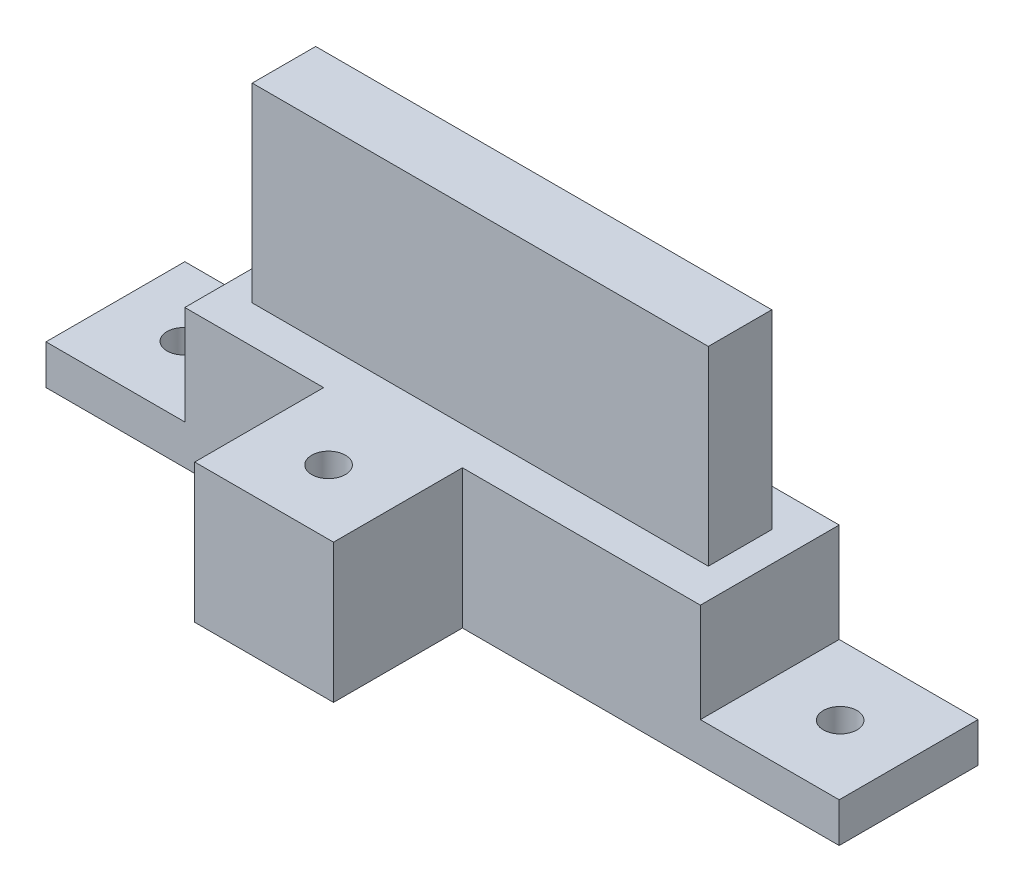
ISO-10303-21;
HEADER;
FILE_DESCRIPTION(('STEP AP214'),'2;1');
FILE_NAME('part.step','',(''),(''),'','','');
FILE_SCHEMA(('AUTOMOTIVE_DESIGN { 1 0 10303 214 1 1 1 1 }'));
ENDSEC;
DATA;
#1=APPLICATION_CONTEXT('core data for automotive mechanical design processes');
#2=APPLICATION_PROTOCOL_DEFINITION('international standard','automotive_design',2000,#1);
#3=PRODUCT_CONTEXT('',#1,'mechanical');
#4=PRODUCT('Part','Part','',(#3));
#5=PRODUCT_RELATED_PRODUCT_CATEGORY('part','',(#4));
#6=PRODUCT_DEFINITION_FORMATION('','',#4);
#7=PRODUCT_DEFINITION_CONTEXT('part definition',#1,'design');
#8=PRODUCT_DEFINITION('design','',#6,#7);
#9=PRODUCT_DEFINITION_SHAPE('','',#8);
#10=(LENGTH_UNIT() NAMED_UNIT(*) SI_UNIT(.MILLI.,.METRE.));
#11=(NAMED_UNIT(*) PLANE_ANGLE_UNIT() SI_UNIT($,.RADIAN.));
#12=(NAMED_UNIT(*) SI_UNIT($,.STERADIAN.) SOLID_ANGLE_UNIT());
#13=UNCERTAINTY_MEASURE_WITH_UNIT(LENGTH_MEASURE(1.E-05),#10,'distance_accuracy_value','');
#14=(GEOMETRIC_REPRESENTATION_CONTEXT(3) GLOBAL_UNCERTAINTY_ASSIGNED_CONTEXT((#13)) GLOBAL_UNIT_ASSIGNED_CONTEXT((#10,
#11,#12)) REPRESENTATION_CONTEXT('',''));
#15=CARTESIAN_POINT('',(0.,0.,0.));
#16=DIRECTION('',(0.,0.,1.));
#17=DIRECTION('',(1.,0.,0.));
#18=AXIS2_PLACEMENT_3D('',#15,#16,#17);
#19=CARTESIAN_POINT('',(0.,0.,17.5));
#20=DIRECTION('',(0.,0.,1.));
#21=DIRECTION('',(1.,0.,0.));
#22=AXIS2_PLACEMENT_3D('',#19,#20,#21);
#23=PLANE('',#22);
#24=DIRECTION('',(1.,0.,0.));
#25=VECTOR('',#24,1.);
#26=CARTESIAN_POINT('',(-100.,0.,17.5));
#27=LINE('',#26,#25);
#28=CARTESIAN_POINT('',(-100.,0.,17.5));
#29=VERTEX_POINT('',#28);
#30=CARTESIAN_POINT('',(-30.,0.,17.5));
#31=VERTEX_POINT('',#30);
#32=EDGE_CURVE('E57',#29,#31,#27,.T.);
#33=ORIENTED_EDGE('',*,*,#32,.T.);
#34=DIRECTION('',(0.,1.,0.));
#35=VECTOR('',#34,1.);
#36=CARTESIAN_POINT('',(-30.,0.,17.5));
#37=LINE('',#36,#35);
#38=CARTESIAN_POINT('',(-30.,35.,17.5));
#39=VERTEX_POINT('',#38);
#40=EDGE_CURVE('E195',#31,#39,#37,.T.);
#41=ORIENTED_EDGE('',*,*,#40,.T.);
#42=DIRECTION('',(-1.,0.,0.));
#43=VECTOR('',#42,1.);
#44=CARTESIAN_POINT('',(65.,35.,17.5));
#45=LINE('',#44,#43);
#46=CARTESIAN_POINT('',(-65.,35.,17.5));
#47=VERTEX_POINT('',#46);
#48=EDGE_CURVE('E232',#39,#47,#45,.T.);
#49=ORIENTED_EDGE('',*,*,#48,.T.);
#50=DIRECTION('',(0.,-1.,0.));
#51=VECTOR('',#50,1.);
#52=CARTESIAN_POINT('',(-65.,9.99999999999998,17.5));
#53=LINE('',#52,#51);
#54=CARTESIAN_POINT('',(-65.,9.99999999999998,17.5));
#55=VERTEX_POINT('',#54);
#56=EDGE_CURVE('E235',#47,#55,#53,.T.);
#57=ORIENTED_EDGE('',*,*,#56,.T.);
#58=DIRECTION('',(-1.,0.,0.));
#59=VECTOR('',#58,1.);
#60=CARTESIAN_POINT('',(-100.,9.99999999999998,17.5));
#61=LINE('',#60,#59);
#62=CARTESIAN_POINT('',(-100.,9.99999999999998,17.5));
#63=VERTEX_POINT('',#62);
#64=EDGE_CURVE('E237',#55,#63,#61,.T.);
#65=ORIENTED_EDGE('',*,*,#64,.T.);
#66=DIRECTION('',(0.,-1.,0.));
#67=VECTOR('',#66,1.);
#68=CARTESIAN_POINT('',(-100.,0.,17.5));
#69=LINE('',#68,#67);
#70=EDGE_CURVE('E239',#63,#29,#69,.T.);
#71=ORIENTED_EDGE('',*,*,#70,.T.);
#72=EDGE_LOOP('',(#33,#41,#49,#57,#65,#71));
#73=FACE_BOUND('',#72,.T.);
#74=ADVANCED_FACE('F34',(#73),#23,.T.);
#75=CARTESIAN_POINT('',(65.,35.,17.5));
#76=VERTEX_POINT('',#75);
#77=CARTESIAN_POINT('',(4.99999999999999,35.,17.5));
#78=VERTEX_POINT('',#77);
#79=EDGE_CURVE('E233',#76,#78,#45,.T.);
#80=ORIENTED_EDGE('',*,*,#79,.T.);
#81=DIRECTION('',(0.,-1.,0.));
#82=VECTOR('',#81,1.);
#83=CARTESIAN_POINT('',(4.99999999999999,0.,17.5));
#84=LINE('',#83,#82);
#85=CARTESIAN_POINT('',(4.99999999999999,0.,17.5));
#86=VERTEX_POINT('',#85);
#87=EDGE_CURVE('E49',#78,#86,#84,.T.);
#88=ORIENTED_EDGE('',*,*,#87,.T.);
#89=CARTESIAN_POINT('',(100.,0.,17.5));
#90=VERTEX_POINT('',#89);
#91=EDGE_CURVE('E241',#86,#90,#27,.T.);
#92=ORIENTED_EDGE('',*,*,#91,.T.);
#93=DIRECTION('',(0.,1.,0.));
#94=VECTOR('',#93,1.);
#95=CARTESIAN_POINT('',(100.,0.,17.5));
#96=LINE('',#95,#94);
#97=CARTESIAN_POINT('',(100.,10.,17.5));
#98=VERTEX_POINT('',#97);
#99=EDGE_CURVE('E224',#90,#98,#96,.T.);
#100=ORIENTED_EDGE('',*,*,#99,.T.);
#101=DIRECTION('',(-1.,0.,0.));
#102=VECTOR('',#101,1.);
#103=CARTESIAN_POINT('',(100.,10.,17.5));
#104=LINE('',#103,#102);
#105=CARTESIAN_POINT('',(65.,10.,17.5));
#106=VERTEX_POINT('',#105);
#107=EDGE_CURVE('E227',#98,#106,#104,.T.);
#108=ORIENTED_EDGE('',*,*,#107,.T.);
#109=DIRECTION('',(0.,1.,0.));
#110=VECTOR('',#109,1.);
#111=CARTESIAN_POINT('',(65.,10.,17.5));
#112=LINE('',#111,#110);
#113=EDGE_CURVE('E230',#106,#76,#112,.T.);
#114=ORIENTED_EDGE('',*,*,#113,.T.);
#115=EDGE_LOOP('',(#80,#88,#92,#100,#108,#114));
#116=FACE_BOUND('',#115,.T.);
#117=ADVANCED_FACE('F367',(#116),#23,.T.);
#118=CARTESIAN_POINT('',(0.,0.,-17.5));
#119=DIRECTION('',(0.,0.,1.));
#120=DIRECTION('',(1.,0.,0.));
#121=AXIS2_PLACEMENT_3D('',#118,#119,#120);
#122=PLANE('',#121);
#123=DIRECTION('',(0.,1.,0.));
#124=VECTOR('',#123,1.);
#125=CARTESIAN_POINT('',(-30.,0.,-17.5));
#126=LINE('',#125,#124);
#127=CARTESIAN_POINT('',(-30.,0.,-17.5));
#128=VERTEX_POINT('',#127);
#129=CARTESIAN_POINT('',(-30.,35.,-17.5));
#130=VERTEX_POINT('',#129);
#131=EDGE_CURVE('E12',#128,#130,#126,.T.);
#132=ORIENTED_EDGE('',*,*,#131,.F.);
#133=DIRECTION('',(1.,0.,0.));
#134=VECTOR('',#133,1.);
#135=CARTESIAN_POINT('',(-100.,0.,-17.5));
#136=LINE('',#135,#134);
#137=CARTESIAN_POINT('',(-100.,0.,-17.5));
#138=VERTEX_POINT('',#137);
#139=EDGE_CURVE('E228',#138,#128,#136,.T.);
#140=ORIENTED_EDGE('',*,*,#139,.F.);
#141=DIRECTION('',(0.,-1.,0.));
#142=VECTOR('',#141,1.);
#143=CARTESIAN_POINT('',(-100.,0.,-17.5));
#144=LINE('',#143,#142);
#145=CARTESIAN_POINT('',(-100.,9.99999999999998,-17.5));
#146=VERTEX_POINT('',#145);
#147=EDGE_CURVE('E259',#146,#138,#144,.T.);
#148=ORIENTED_EDGE('',*,*,#147,.F.);
#149=DIRECTION('',(-1.,0.,0.));
#150=VECTOR('',#149,1.);
#151=CARTESIAN_POINT('',(-100.,9.99999999999998,-17.5));
#152=LINE('',#151,#150);
#153=CARTESIAN_POINT('',(-65.,9.99999999999998,-17.5));
#154=VERTEX_POINT('',#153);
#155=EDGE_CURVE('E257',#154,#146,#152,.T.);
#156=ORIENTED_EDGE('',*,*,#155,.F.);
#157=DIRECTION('',(0.,-1.,0.));
#158=VECTOR('',#157,1.);
#159=CARTESIAN_POINT('',(-65.,9.99999999999998,-17.5));
#160=LINE('',#159,#158);
#161=CARTESIAN_POINT('',(-65.,35.,-17.5));
#162=VERTEX_POINT('',#161);
#163=EDGE_CURVE('E255',#162,#154,#160,.T.);
#164=ORIENTED_EDGE('',*,*,#163,.F.);
#165=DIRECTION('',(-1.,0.,0.));
#166=VECTOR('',#165,1.);
#167=CARTESIAN_POINT('',(-65.,35.,-17.5));
#168=LINE('',#167,#166);
#169=EDGE_CURVE('E251',#130,#162,#168,.T.);
#170=ORIENTED_EDGE('',*,*,#169,.F.);
#171=EDGE_LOOP('',(#132,#140,#148,#156,#164,#170));
#172=FACE_BOUND('',#171,.T.);
#173=ADVANCED_FACE('F355',(#172),#122,.F.);
#174=DIRECTION('',(0.,-1.,0.));
#175=VECTOR('',#174,1.);
#176=CARTESIAN_POINT('',(4.99999999999999,0.,-17.5));
#177=LINE('',#176,#175);
#178=CARTESIAN_POINT('',(4.99999999999999,35.,-17.5));
#179=VERTEX_POINT('',#178);
#180=CARTESIAN_POINT('',(4.99999999999999,0.,-17.5));
#181=VERTEX_POINT('',#180);
#182=EDGE_CURVE('E42',#179,#181,#177,.T.);
#183=ORIENTED_EDGE('',*,*,#182,.F.);
#184=CARTESIAN_POINT('',(65.,35.,-17.5));
#185=VERTEX_POINT('',#184);
#186=EDGE_CURVE('E252',#185,#179,#168,.T.);
#187=ORIENTED_EDGE('',*,*,#186,.F.);
#188=DIRECTION('',(0.,1.,0.));
#189=VECTOR('',#188,1.);
#190=CARTESIAN_POINT('',(65.,10.,-17.5));
#191=LINE('',#190,#189);
#192=CARTESIAN_POINT('',(65.,10.,-17.5));
#193=VERTEX_POINT('',#192);
#194=EDGE_CURVE('E248',#193,#185,#191,.T.);
#195=ORIENTED_EDGE('',*,*,#194,.F.);
#196=DIRECTION('',(-1.,0.,0.));
#197=VECTOR('',#196,1.);
#198=CARTESIAN_POINT('',(100.,10.,-17.5));
#199=LINE('',#198,#197);
#200=CARTESIAN_POINT('',(100.,10.,-17.5));
#201=VERTEX_POINT('',#200);
#202=EDGE_CURVE('E246',#201,#193,#199,.T.);
#203=ORIENTED_EDGE('',*,*,#202,.F.);
#204=DIRECTION('',(0.,1.,0.));
#205=VECTOR('',#204,1.);
#206=CARTESIAN_POINT('',(100.,0.,-17.5));
#207=LINE('',#206,#205);
#208=CARTESIAN_POINT('',(100.,0.,-17.5));
#209=VERTEX_POINT('',#208);
#210=EDGE_CURVE('E217',#209,#201,#207,.T.);
#211=ORIENTED_EDGE('',*,*,#210,.F.);
#212=EDGE_CURVE('E261',#181,#209,#136,.T.);
#213=ORIENTED_EDGE('',*,*,#212,.F.);
#214=EDGE_LOOP('',(#183,#187,#195,#203,#211,#213));
#215=FACE_BOUND('',#214,.T.);
#216=ADVANCED_FACE('F313',(#215),#122,.F.);
#217=CARTESIAN_POINT('',(57.5,35.,17.5));
#218=DIRECTION('',(-1.,0.,0.));
#219=DIRECTION('',(0.,-1.,0.));
#220=AXIS2_PLACEMENT_3D('',#217,#218,#219);
#221=PLANE('',#220);
#222=DIRECTION('',(0.,1.,0.));
#223=VECTOR('',#222,1.);
#224=CARTESIAN_POINT('',(57.5,-170.069799092894,-8.));
#225=LINE('',#224,#223);
#226=CARTESIAN_POINT('',(57.5,35.,-8.));
#227=VERTEX_POINT('',#226);
#228=CARTESIAN_POINT('',(57.5,83.,-8.));
#229=VERTEX_POINT('',#228);
#230=EDGE_CURVE('E208',#227,#229,#225,.T.);
#231=ORIENTED_EDGE('',*,*,#230,.T.);
#232=DIRECTION('',(0.,0.,-1.));
#233=VECTOR('',#232,1.);
#234=CARTESIAN_POINT('',(57.5,83.,17.5));
#235=LINE('',#234,#233);
#236=CARTESIAN_POINT('',(57.5,83.,8.));
#237=VERTEX_POINT('',#236);
#238=EDGE_CURVE('E284',#237,#229,#235,.T.);
#239=ORIENTED_EDGE('',*,*,#238,.F.);
#240=DIRECTION('',(0.,1.,0.));
#241=VECTOR('',#240,1.);
#242=CARTESIAN_POINT('',(57.5,-170.069799092894,8.));
#243=LINE('',#242,#241);
#244=CARTESIAN_POINT('',(57.5,35.,8.));
#245=VERTEX_POINT('',#244);
#246=EDGE_CURVE('E207',#245,#237,#243,.T.);
#247=ORIENTED_EDGE('',*,*,#246,.F.);
#248=DIRECTION('',(0.,0.,-1.));
#249=VECTOR('',#248,1.);
#250=CARTESIAN_POINT('',(57.5,35.,17.5));
#251=LINE('',#250,#249);
#252=EDGE_CURVE('E287',#245,#227,#251,.T.);
#253=ORIENTED_EDGE('',*,*,#252,.T.);
#254=EDGE_LOOP('',(#231,#239,#247,#253));
#255=FACE_BOUND('',#254,.T.);
#256=ADVANCED_FACE('F399',(#255),#221,.F.);
#257=CARTESIAN_POINT('',(57.5,83.,17.5));
#258=DIRECTION('',(0.,-1.,0.));
#259=DIRECTION('',(1.,0.,0.));
#260=AXIS2_PLACEMENT_3D('',#257,#258,#259);
#261=PLANE('',#260);
#262=DIRECTION('',(-1.,0.,0.));
#263=VECTOR('',#262,1.);
#264=CARTESIAN_POINT('',(-57.5,83.,-8.));
#265=LINE('',#264,#263);
#266=CARTESIAN_POINT('',(-57.5,83.,-8.));
#267=VERTEX_POINT('',#266);
#268=EDGE_CURVE('E204',#229,#267,#265,.T.);
#269=ORIENTED_EDGE('',*,*,#268,.T.);
#270=DIRECTION('',(0.,0.,-1.));
#271=VECTOR('',#270,1.);
#272=CARTESIAN_POINT('',(-57.5,83.,17.5));
#273=LINE('',#272,#271);
#274=CARTESIAN_POINT('',(-57.5,83.,8.));
#275=VERTEX_POINT('',#274);
#276=EDGE_CURVE('E281',#275,#267,#273,.T.);
#277=ORIENTED_EDGE('',*,*,#276,.F.);
#278=DIRECTION('',(1.,0.,0.));
#279=VECTOR('',#278,1.);
#280=CARTESIAN_POINT('',(-57.5,83.,8.));
#281=LINE('',#280,#279);
#282=EDGE_CURVE('E209',#275,#237,#281,.T.);
#283=ORIENTED_EDGE('',*,*,#282,.T.);
#284=ORIENTED_EDGE('',*,*,#238,.T.);
#285=EDGE_LOOP('',(#269,#277,#283,#284));
#286=FACE_BOUND('',#285,.T.);
#287=ADVANCED_FACE('F395',(#286),#261,.F.);
#288=CARTESIAN_POINT('',(-57.5,35.,17.5));
#289=DIRECTION('',(1.,0.,0.));
#290=DIRECTION('',(0.,1.,0.));
#291=AXIS2_PLACEMENT_3D('',#288,#289,#290);
#292=PLANE('',#291);
#293=DIRECTION('',(0.,1.,0.));
#294=VECTOR('',#293,1.);
#295=CARTESIAN_POINT('',(-57.5,-170.069799092894,-8.));
#296=LINE('',#295,#294);
#297=CARTESIAN_POINT('',(-57.5,35.,-8.));
#298=VERTEX_POINT('',#297);
#299=EDGE_CURVE('E203',#298,#267,#296,.T.);
#300=ORIENTED_EDGE('',*,*,#299,.F.);
#301=DIRECTION('',(0.,0.,-1.));
#302=VECTOR('',#301,1.);
#303=CARTESIAN_POINT('',(-57.5,35.,17.5));
#304=LINE('',#303,#302);
#305=CARTESIAN_POINT('',(-57.5,35.,8.));
#306=VERTEX_POINT('',#305);
#307=EDGE_CURVE('E278',#306,#298,#304,.T.);
#308=ORIENTED_EDGE('',*,*,#307,.F.);
#309=DIRECTION('',(0.,1.,0.));
#310=VECTOR('',#309,1.);
#311=CARTESIAN_POINT('',(-57.5,-170.069799092894,8.));
#312=LINE('',#311,#310);
#313=EDGE_CURVE('E213',#306,#275,#312,.T.);
#314=ORIENTED_EDGE('',*,*,#313,.T.);
#315=ORIENTED_EDGE('',*,*,#276,.T.);
#316=EDGE_LOOP('',(#300,#308,#314,#315));
#317=FACE_BOUND('',#316,.T.);
#318=ADVANCED_FACE('F392',(#317),#292,.F.);
#319=CARTESIAN_POINT('',(100.,0.,17.5));
#320=DIRECTION('',(-1.,0.,0.));
#321=DIRECTION('',(0.,0.,1.));
#322=AXIS2_PLACEMENT_3D('',#319,#320,#321);
#323=PLANE('',#322);
#324=ORIENTED_EDGE('',*,*,#210,.T.);
#325=DIRECTION('',(0.,0.,-1.));
#326=VECTOR('',#325,1.);
#327=CARTESIAN_POINT('',(100.,10.,17.5));
#328=LINE('',#327,#326);
#329=EDGE_CURVE('E296',#98,#201,#328,.T.);
#330=ORIENTED_EDGE('',*,*,#329,.F.);
#331=ORIENTED_EDGE('',*,*,#99,.F.);
#332=DIRECTION('',(0.,0.,-1.));
#333=VECTOR('',#332,1.);
#334=CARTESIAN_POINT('',(100.,0.,17.5));
#335=LINE('',#334,#333);
#336=EDGE_CURVE('E243',#90,#209,#335,.T.);
#337=ORIENTED_EDGE('',*,*,#336,.T.);
#338=EDGE_LOOP('',(#324,#330,#331,#337));
#339=FACE_BOUND('',#338,.T.);
#340=ADVANCED_FACE('F36',(#339),#323,.F.);
#341=CARTESIAN_POINT('',(100.,10.,17.5));
#342=DIRECTION('',(0.,-1.,0.));
#343=DIRECTION('',(1.,0.,0.));
#344=AXIS2_PLACEMENT_3D('',#341,#342,#343);
#345=PLANE('',#344);
#346=CARTESIAN_POINT('',(82.75,10.,0.));
#347=DIRECTION('',(0.,-1.,0.));
#348=DIRECTION('',(1.,0.,0.));
#349=AXIS2_PLACEMENT_3D('',#346,#347,#348);
#350=CIRCLE('',#349,4.25000000000001);
#351=CARTESIAN_POINT('',(87.,10.,0.));
#352=VERTEX_POINT('',#351);
#353=EDGE_CURVE('E415',#352,#352,#350,.T.);
#354=ORIENTED_EDGE('',*,*,#353,.T.);
#355=EDGE_LOOP('',(#354));
#356=FACE_BOUND('',#355,.T.);
#357=ORIENTED_EDGE('',*,*,#202,.T.);
#358=DIRECTION('',(0.,0.,-1.));
#359=VECTOR('',#358,1.);
#360=CARTESIAN_POINT('',(65.,10.,17.5));
#361=LINE('',#360,#359);
#362=EDGE_CURVE('E293',#106,#193,#361,.T.);
#363=ORIENTED_EDGE('',*,*,#362,.F.);
#364=ORIENTED_EDGE('',*,*,#107,.F.);
#365=ORIENTED_EDGE('',*,*,#329,.T.);
#366=EDGE_LOOP('',(#357,#363,#364,#365));
#367=FACE_BOUND('',#366,.T.);
#368=ADVANCED_FACE('F405',(#356,#367),#345,.F.);
#369=CARTESIAN_POINT('',(65.,10.,17.5));
#370=DIRECTION('',(-1.,0.,0.));
#371=DIRECTION('',(0.,-1.,0.));
#372=AXIS2_PLACEMENT_3D('',#369,#370,#371);
#373=PLANE('',#372);
#374=ORIENTED_EDGE('',*,*,#194,.T.);
#375=DIRECTION('',(0.,0.,-1.));
#376=VECTOR('',#375,1.);
#377=CARTESIAN_POINT('',(65.,35.,17.5));
#378=LINE('',#377,#376);
#379=EDGE_CURVE('E290',#76,#185,#378,.T.);
#380=ORIENTED_EDGE('',*,*,#379,.F.);
#381=ORIENTED_EDGE('',*,*,#113,.F.);
#382=ORIENTED_EDGE('',*,*,#362,.T.);
#383=EDGE_LOOP('',(#374,#380,#381,#382));
#384=FACE_BOUND('',#383,.T.);
#385=ADVANCED_FACE('F390',(#384),#373,.F.);
#386=CARTESIAN_POINT('',(-65.,35.,17.5));
#387=DIRECTION('',(0.,-1.,0.));
#388=DIRECTION('',(0.,0.,-1.));
#389=AXIS2_PLACEMENT_3D('',#386,#387,#388);
#390=PLANE('',#389);
#391=CARTESIAN_POINT('',(-12.5,35.,33.75));
#392=DIRECTION('',(0.,1.,0.));
#393=DIRECTION('',(0.,0.,1.));
#394=AXIS2_PLACEMENT_3D('',#391,#392,#393);
#395=CIRCLE('',#394,4.25);
#396=CARTESIAN_POINT('',(-12.5,35.,38.));
#397=VERTEX_POINT('',#396);
#398=EDGE_CURVE('E425',#397,#397,#395,.T.);
#399=ORIENTED_EDGE('',*,*,#398,.F.);
#400=EDGE_LOOP('',(#399));
#401=FACE_BOUND('',#400,.T.);
#402=CARTESIAN_POINT('',(-12.5,35.,-33.75));
#403=DIRECTION('',(0.,1.,0.));
#404=DIRECTION('',(0.,0.,-1.));
#405=AXIS2_PLACEMENT_3D('',#402,#403,#404);
#406=CIRCLE('',#405,4.25);
#407=CARTESIAN_POINT('',(-12.5,35.,-38.));
#408=VERTEX_POINT('',#407);
#409=EDGE_CURVE('E428',#408,#408,#406,.T.);
#410=ORIENTED_EDGE('',*,*,#409,.F.);
#411=EDGE_LOOP('',(#410));
#412=FACE_BOUND('',#411,.T.);
#413=ORIENTED_EDGE('',*,*,#307,.T.);
#414=DIRECTION('',(-1.,0.,0.));
#415=VECTOR('',#414,1.);
#416=CARTESIAN_POINT('',(-57.5,35.,-8.));
#417=LINE('',#416,#415);
#418=EDGE_CURVE('E212',#227,#298,#417,.T.);
#419=ORIENTED_EDGE('',*,*,#418,.F.);
#420=ORIENTED_EDGE('',*,*,#252,.F.);
#421=DIRECTION('',(1.,0.,0.));
#422=VECTOR('',#421,1.);
#423=CARTESIAN_POINT('',(-57.5,35.,8.));
#424=LINE('',#423,#422);
#425=EDGE_CURVE('E215',#306,#245,#424,.T.);
#426=ORIENTED_EDGE('',*,*,#425,.F.);
#427=EDGE_LOOP('',(#413,#419,#420,#426));
#428=FACE_BOUND('',#427,.T.);
#429=DIRECTION('',(0.,0.,-1.));
#430=VECTOR('',#429,1.);
#431=CARTESIAN_POINT('',(-30.,35.,50.));
#432=LINE('',#431,#430);
#433=CARTESIAN_POINT('',(-30.,35.,-50.));
#434=VERTEX_POINT('',#433);
#435=EDGE_CURVE('E323',#130,#434,#432,.T.);
#436=ORIENTED_EDGE('',*,*,#435,.F.);
#437=ORIENTED_EDGE('',*,*,#169,.T.);
#438=DIRECTION('',(0.,0.,-1.));
#439=VECTOR('',#438,1.);
#440=CARTESIAN_POINT('',(-65.,35.,17.5));
#441=LINE('',#440,#439);
#442=EDGE_CURVE('E275',#47,#162,#441,.T.);
#443=ORIENTED_EDGE('',*,*,#442,.F.);
#444=ORIENTED_EDGE('',*,*,#48,.F.);
#445=CARTESIAN_POINT('',(-30.,35.,50.));
#446=VERTEX_POINT('',#445);
#447=EDGE_CURVE('E335',#446,#39,#432,.T.);
#448=ORIENTED_EDGE('',*,*,#447,.F.);
#449=DIRECTION('',(-1.,0.,0.));
#450=VECTOR('',#449,1.);
#451=CARTESIAN_POINT('',(-30.,35.,50.));
#452=LINE('',#451,#450);
#453=CARTESIAN_POINT('',(4.99999999999999,35.,50.));
#454=VERTEX_POINT('',#453);
#455=EDGE_CURVE('E188',#454,#446,#452,.T.);
#456=ORIENTED_EDGE('',*,*,#455,.F.);
#457=DIRECTION('',(0.,0.,-1.));
#458=VECTOR('',#457,1.);
#459=CARTESIAN_POINT('',(4.99999999999999,35.,50.));
#460=LINE('',#459,#458);
#461=EDGE_CURVE('E311',#454,#78,#460,.T.);
#462=ORIENTED_EDGE('',*,*,#461,.T.);
#463=ORIENTED_EDGE('',*,*,#79,.F.);
#464=ORIENTED_EDGE('',*,*,#379,.T.);
#465=ORIENTED_EDGE('',*,*,#186,.T.);
#466=CARTESIAN_POINT('',(4.99999999999999,35.,-50.));
#467=VERTEX_POINT('',#466);
#468=EDGE_CURVE('E304',#179,#467,#460,.T.);
#469=ORIENTED_EDGE('',*,*,#468,.T.);
#470=DIRECTION('',(-1.,0.,0.));
#471=VECTOR('',#470,1.);
#472=CARTESIAN_POINT('',(-30.,35.,-50.));
#473=LINE('',#472,#471);
#474=EDGE_CURVE('E192',#467,#434,#473,.T.);
#475=ORIENTED_EDGE('',*,*,#474,.T.);
#476=EDGE_LOOP('',(#436,#437,#443,#444,#448,#456,#462,#463,#464,#465,#469,#475));
#477=FACE_BOUND('',#476,.T.);
#478=ADVANCED_FACE('F338',(#401,#412,#428,#477),#390,.F.);
#479=CARTESIAN_POINT('',(-65.,9.99999999999998,17.5));
#480=DIRECTION('',(1.,0.,0.));
#481=DIRECTION('',(0.,1.,0.));
#482=AXIS2_PLACEMENT_3D('',#479,#480,#481);
#483=PLANE('',#482);
#484=ORIENTED_EDGE('',*,*,#163,.T.);
#485=DIRECTION('',(0.,0.,-1.));
#486=VECTOR('',#485,1.);
#487=CARTESIAN_POINT('',(-65.,9.99999999999998,17.5));
#488=LINE('',#487,#486);
#489=EDGE_CURVE('E272',#55,#154,#488,.T.);
#490=ORIENTED_EDGE('',*,*,#489,.F.);
#491=ORIENTED_EDGE('',*,*,#56,.F.);
#492=ORIENTED_EDGE('',*,*,#442,.T.);
#493=EDGE_LOOP('',(#484,#490,#491,#492));
#494=FACE_BOUND('',#493,.T.);
#495=ADVANCED_FACE('F352',(#494),#483,.F.);
#496=CARTESIAN_POINT('',(-100.,9.99999999999998,17.5));
#497=DIRECTION('',(0.,-1.,0.));
#498=DIRECTION('',(1.,0.,0.));
#499=AXIS2_PLACEMENT_3D('',#496,#497,#498);
#500=PLANE('',#499);
#501=CARTESIAN_POINT('',(-82.75,9.99999999999998,0.));
#502=DIRECTION('',(0.,-1.,0.));
#503=DIRECTION('',(1.,0.,0.));
#504=AXIS2_PLACEMENT_3D('',#501,#502,#503);
#505=CIRCLE('',#504,4.25000000000001);
#506=CARTESIAN_POINT('',(-78.5,9.99999999999998,0.));
#507=VERTEX_POINT('',#506);
#508=EDGE_CURVE('E329',#507,#507,#505,.T.);
#509=ORIENTED_EDGE('',*,*,#508,.T.);
#510=EDGE_LOOP('',(#509));
#511=FACE_BOUND('',#510,.T.);
#512=ORIENTED_EDGE('',*,*,#155,.T.);
#513=DIRECTION('',(0.,0.,-1.));
#514=VECTOR('',#513,1.);
#515=CARTESIAN_POINT('',(-100.,9.99999999999998,17.5));
#516=LINE('',#515,#514);
#517=EDGE_CURVE('E269',#63,#146,#516,.T.);
#518=ORIENTED_EDGE('',*,*,#517,.F.);
#519=ORIENTED_EDGE('',*,*,#64,.F.);
#520=ORIENTED_EDGE('',*,*,#489,.T.);
#521=EDGE_LOOP('',(#512,#518,#519,#520));
#522=FACE_BOUND('',#521,.T.);
#523=ADVANCED_FACE('F360',(#511,#522),#500,.F.);
#524=CARTESIAN_POINT('',(-100.,0.,17.5));
#525=DIRECTION('',(1.,0.,0.));
#526=DIRECTION('',(0.,1.,0.));
#527=AXIS2_PLACEMENT_3D('',#524,#525,#526);
#528=PLANE('',#527);
#529=ORIENTED_EDGE('',*,*,#147,.T.);
#530=DIRECTION('',(0.,0.,-1.));
#531=VECTOR('',#530,1.);
#532=CARTESIAN_POINT('',(-100.,0.,17.5));
#533=LINE('',#532,#531);
#534=EDGE_CURVE('E266',#29,#138,#533,.T.);
#535=ORIENTED_EDGE('',*,*,#534,.F.);
#536=ORIENTED_EDGE('',*,*,#70,.F.);
#537=ORIENTED_EDGE('',*,*,#517,.T.);
#538=EDGE_LOOP('',(#529,#535,#536,#537));
#539=FACE_BOUND('',#538,.T.);
#540=ADVANCED_FACE('F364',(#539),#528,.F.);
#541=CARTESIAN_POINT('',(-100.,0.,17.5));
#542=DIRECTION('',(0.,1.,0.));
#543=DIRECTION('',(-1.,0.,0.));
#544=AXIS2_PLACEMENT_3D('',#541,#542,#543);
#545=PLANE('',#544);
#546=CARTESIAN_POINT('',(-12.5,0.,33.75));
#547=DIRECTION('',(0.,1.,0.));
#548=DIRECTION('',(0.,0.,1.));
#549=AXIS2_PLACEMENT_3D('',#546,#547,#548);
#550=CIRCLE('',#549,4.25);
#551=CARTESIAN_POINT('',(-12.5,0.,38.));
#552=VERTEX_POINT('',#551);
#553=EDGE_CURVE('E420',#552,#552,#550,.T.);
#554=ORIENTED_EDGE('',*,*,#553,.T.);
#555=EDGE_LOOP('',(#554));
#556=FACE_BOUND('',#555,.T.);
#557=CARTESIAN_POINT('',(-82.75,0.,0.));
#558=DIRECTION('',(0.,1.,0.));
#559=DIRECTION('',(0.,0.,1.));
#560=AXIS2_PLACEMENT_3D('',#557,#558,#559);
#561=CIRCLE('',#560,4.25000000000001);
#562=CARTESIAN_POINT('',(-82.75,0.,4.25000000000001));
#563=VERTEX_POINT('',#562);
#564=EDGE_CURVE('E437',#563,#563,#561,.T.);
#565=ORIENTED_EDGE('',*,*,#564,.T.);
#566=EDGE_LOOP('',(#565));
#567=FACE_BOUND('',#566,.T.);
#568=CARTESIAN_POINT('',(82.75,0.,0.));
#569=DIRECTION('',(0.,1.,0.));
#570=DIRECTION('',(0.,0.,1.));
#571=AXIS2_PLACEMENT_3D('',#568,#569,#570);
#572=CIRCLE('',#571,4.25000000000001);
#573=CARTESIAN_POINT('',(82.75,0.,4.25000000000001));
#574=VERTEX_POINT('',#573);
#575=EDGE_CURVE('E434',#574,#574,#572,.T.);
#576=ORIENTED_EDGE('',*,*,#575,.T.);
#577=EDGE_LOOP('',(#576));
#578=FACE_BOUND('',#577,.T.);
#579=CARTESIAN_POINT('',(-12.5,0.,-33.75));
#580=DIRECTION('',(0.,1.,0.));
#581=DIRECTION('',(0.,0.,-1.));
#582=AXIS2_PLACEMENT_3D('',#579,#580,#581);
#583=CIRCLE('',#582,4.25);
#584=CARTESIAN_POINT('',(-12.5,0.,-38.));
#585=VERTEX_POINT('',#584);
#586=EDGE_CURVE('E431',#585,#585,#583,.T.);
#587=ORIENTED_EDGE('',*,*,#586,.T.);
#588=EDGE_LOOP('',(#587));
#589=FACE_BOUND('',#588,.T.);
#590=DIRECTION('',(0.,0.,-1.));
#591=VECTOR('',#590,1.);
#592=CARTESIAN_POINT('',(4.99999999999999,0.,50.));
#593=LINE('',#592,#591);
#594=CARTESIAN_POINT('',(4.99999999999999,0.,-50.));
#595=VERTEX_POINT('',#594);
#596=EDGE_CURVE('E302',#181,#595,#593,.T.);
#597=ORIENTED_EDGE('',*,*,#596,.F.);
#598=ORIENTED_EDGE('',*,*,#212,.T.);
#599=ORIENTED_EDGE('',*,*,#336,.F.);
#600=ORIENTED_EDGE('',*,*,#91,.F.);
#601=CARTESIAN_POINT('',(4.99999999999999,0.,50.));
#602=VERTEX_POINT('',#601);
#603=EDGE_CURVE('E179',#602,#86,#593,.T.);
#604=ORIENTED_EDGE('',*,*,#603,.F.);
#605=DIRECTION('',(1.,0.,0.));
#606=VECTOR('',#605,1.);
#607=CARTESIAN_POINT('',(-30.,0.,50.));
#608=LINE('',#607,#606);
#609=CARTESIAN_POINT('',(-30.,0.,50.));
#610=VERTEX_POINT('',#609);
#611=EDGE_CURVE('E172',#610,#602,#608,.T.);
#612=ORIENTED_EDGE('',*,*,#611,.F.);
#613=DIRECTION('',(0.,0.,-1.));
#614=VECTOR('',#613,1.);
#615=CARTESIAN_POINT('',(-30.,0.,50.));
#616=LINE('',#615,#614);
#617=EDGE_CURVE('E177',#610,#31,#616,.T.);
#618=ORIENTED_EDGE('',*,*,#617,.T.);
#619=ORIENTED_EDGE('',*,*,#32,.F.);
#620=ORIENTED_EDGE('',*,*,#534,.T.);
#621=ORIENTED_EDGE('',*,*,#139,.T.);
#622=CARTESIAN_POINT('',(-30.,0.,-50.));
#623=VERTEX_POINT('',#622);
#624=EDGE_CURVE('E196',#128,#623,#616,.T.);
#625=ORIENTED_EDGE('',*,*,#624,.T.);
#626=DIRECTION('',(1.,0.,0.));
#627=VECTOR('',#626,1.);
#628=CARTESIAN_POINT('',(-30.,0.,-50.));
#629=LINE('',#628,#627);
#630=EDGE_CURVE('E309',#623,#595,#629,.T.);
#631=ORIENTED_EDGE('',*,*,#630,.T.);
#632=EDGE_LOOP('',(#597,#598,#599,#600,#604,#612,#618,#619,#620,#621,#625,#631));
#633=FACE_BOUND('',#632,.T.);
#634=ADVANCED_FACE('F175',(#556,#567,#578,#589,#633),#545,.F.);
#635=CARTESIAN_POINT('',(-57.5,-170.069799092894,-8.));
#636=DIRECTION('',(0.,0.,-1.));
#637=DIRECTION('',(-1.,0.,0.));
#638=AXIS2_PLACEMENT_3D('',#635,#636,#637);
#639=PLANE('',#638);
#640=ORIENTED_EDGE('',*,*,#418,.T.);
#641=ORIENTED_EDGE('',*,*,#299,.T.);
#642=ORIENTED_EDGE('',*,*,#268,.F.);
#643=ORIENTED_EDGE('',*,*,#230,.F.);
#644=EDGE_LOOP('',(#640,#641,#642,#643));
#645=FACE_BOUND('',#644,.T.);
#646=ADVANCED_FACE('F374',(#645),#639,.T.);
#647=CARTESIAN_POINT('',(-57.5,-170.069799092894,8.));
#648=DIRECTION('',(0.,0.,1.));
#649=DIRECTION('',(1.,0.,0.));
#650=AXIS2_PLACEMENT_3D('',#647,#648,#649);
#651=PLANE('',#650);
#652=ORIENTED_EDGE('',*,*,#425,.T.);
#653=ORIENTED_EDGE('',*,*,#246,.T.);
#654=ORIENTED_EDGE('',*,*,#282,.F.);
#655=ORIENTED_EDGE('',*,*,#313,.F.);
#656=EDGE_LOOP('',(#652,#653,#654,#655));
#657=FACE_BOUND('',#656,.T.);
#658=ADVANCED_FACE('F457',(#657),#651,.T.);
#659=CARTESIAN_POINT('',(0.,0.,-50.));
#660=DIRECTION('',(0.,0.,1.));
#661=DIRECTION('',(1.,0.,0.));
#662=AXIS2_PLACEMENT_3D('',#659,#660,#661);
#663=PLANE('',#662);
#664=DIRECTION('',(0.,-1.,0.));
#665=VECTOR('',#664,1.);
#666=CARTESIAN_POINT('',(-30.,35.,-50.));
#667=LINE('',#666,#665);
#668=EDGE_CURVE('E326',#434,#623,#667,.T.);
#669=ORIENTED_EDGE('',*,*,#668,.F.);
#670=ORIENTED_EDGE('',*,*,#474,.F.);
#671=DIRECTION('',(0.,1.,0.));
#672=VECTOR('',#671,1.);
#673=CARTESIAN_POINT('',(4.99999999999999,35.,-50.));
#674=LINE('',#673,#672);
#675=EDGE_CURVE('E331',#595,#467,#674,.T.);
#676=ORIENTED_EDGE('',*,*,#675,.F.);
#677=ORIENTED_EDGE('',*,*,#630,.F.);
#678=EDGE_LOOP('',(#669,#670,#676,#677));
#679=FACE_BOUND('',#678,.T.);
#680=ADVANCED_FACE('F342',(#679),#663,.F.);
#681=CARTESIAN_POINT('',(4.99999999999999,35.,50.));
#682=DIRECTION('',(-1.,0.,0.));
#683=DIRECTION('',(0.,-1.,0.));
#684=AXIS2_PLACEMENT_3D('',#681,#682,#683);
#685=PLANE('',#684);
#686=ORIENTED_EDGE('',*,*,#468,.F.);
#687=ORIENTED_EDGE('',*,*,#182,.T.);
#688=ORIENTED_EDGE('',*,*,#596,.T.);
#689=ORIENTED_EDGE('',*,*,#675,.T.);
#690=EDGE_LOOP('',(#686,#687,#688,#689));
#691=FACE_BOUND('',#690,.T.);
#692=ADVANCED_FACE('F300',(#691),#685,.F.);
#693=CARTESIAN_POINT('',(-30.,35.,50.));
#694=DIRECTION('',(1.,0.,0.));
#695=DIRECTION('',(0.,1.,0.));
#696=AXIS2_PLACEMENT_3D('',#693,#694,#695);
#697=PLANE('',#696);
#698=ORIENTED_EDGE('',*,*,#624,.F.);
#699=ORIENTED_EDGE('',*,*,#131,.T.);
#700=ORIENTED_EDGE('',*,*,#435,.T.);
#701=ORIENTED_EDGE('',*,*,#668,.T.);
#702=EDGE_LOOP('',(#698,#699,#700,#701));
#703=FACE_BOUND('',#702,.T.);
#704=ADVANCED_FACE('F344',(#703),#697,.F.);
#705=ORIENTED_EDGE('',*,*,#40,.F.);
#706=ORIENTED_EDGE('',*,*,#617,.F.);
#707=DIRECTION('',(0.,-1.,0.));
#708=VECTOR('',#707,1.);
#709=CARTESIAN_POINT('',(-30.,35.,50.));
#710=LINE('',#709,#708);
#711=EDGE_CURVE('E183',#446,#610,#710,.T.);
#712=ORIENTED_EDGE('',*,*,#711,.F.);
#713=ORIENTED_EDGE('',*,*,#447,.T.);
#714=EDGE_LOOP('',(#705,#706,#712,#713));
#715=FACE_BOUND('',#714,.T.);
#716=ADVANCED_FACE('F194',(#715),#697,.F.);
#717=ORIENTED_EDGE('',*,*,#87,.F.);
#718=ORIENTED_EDGE('',*,*,#461,.F.);
#719=DIRECTION('',(0.,1.,0.));
#720=VECTOR('',#719,1.);
#721=CARTESIAN_POINT('',(4.99999999999999,35.,50.));
#722=LINE('',#721,#720);
#723=EDGE_CURVE('E182',#602,#454,#722,.T.);
#724=ORIENTED_EDGE('',*,*,#723,.F.);
#725=ORIENTED_EDGE('',*,*,#603,.T.);
#726=EDGE_LOOP('',(#717,#718,#724,#725));
#727=FACE_BOUND('',#726,.T.);
#728=ADVANCED_FACE('F319',(#727),#685,.F.);
#729=CARTESIAN_POINT('',(0.,0.,50.));
#730=DIRECTION('',(0.,0.,1.));
#731=DIRECTION('',(1.,0.,0.));
#732=AXIS2_PLACEMENT_3D('',#729,#730,#731);
#733=PLANE('',#732);
#734=ORIENTED_EDGE('',*,*,#711,.T.);
#735=ORIENTED_EDGE('',*,*,#611,.T.);
#736=ORIENTED_EDGE('',*,*,#723,.T.);
#737=ORIENTED_EDGE('',*,*,#455,.T.);
#738=EDGE_LOOP('',(#734,#735,#736,#737));
#739=FACE_BOUND('',#738,.T.);
#740=ADVANCED_FACE('F186',(#739),#733,.T.);
#741=CARTESIAN_POINT('',(-12.5,0.,-33.75));
#742=DIRECTION('',(0.,1.,0.));
#743=DIRECTION('',(0.,0.,1.));
#744=AXIS2_PLACEMENT_3D('',#741,#742,#743);
#745=CYLINDRICAL_SURFACE('',#744,4.25);
#746=ORIENTED_EDGE('',*,*,#586,.F.);
#747=EDGE_LOOP('',(#746));
#748=FACE_BOUND('',#747,.T.);
#749=ORIENTED_EDGE('',*,*,#409,.T.);
#750=EDGE_LOOP('',(#749));
#751=FACE_BOUND('',#750,.T.);
#752=ADVANCED_FACE('F471',(#748,#751),#745,.F.);
#753=CARTESIAN_POINT('',(82.75,0.,0.));
#754=DIRECTION('',(0.,1.,0.));
#755=DIRECTION('',(0.,0.,1.));
#756=AXIS2_PLACEMENT_3D('',#753,#754,#755);
#757=CYLINDRICAL_SURFACE('',#756,4.25000000000001);
#758=ORIENTED_EDGE('',*,*,#575,.F.);
#759=EDGE_LOOP('',(#758));
#760=FACE_BOUND('',#759,.T.);
#761=ORIENTED_EDGE('',*,*,#353,.F.);
#762=EDGE_LOOP('',(#761));
#763=FACE_BOUND('',#762,.T.);
#764=ADVANCED_FACE('F474',(#760,#763),#757,.F.);
#765=CARTESIAN_POINT('',(-82.75,0.,0.));
#766=DIRECTION('',(0.,1.,0.));
#767=DIRECTION('',(0.,0.,1.));
#768=AXIS2_PLACEMENT_3D('',#765,#766,#767);
#769=CYLINDRICAL_SURFACE('',#768,4.25000000000001);
#770=ORIENTED_EDGE('',*,*,#564,.F.);
#771=EDGE_LOOP('',(#770));
#772=FACE_BOUND('',#771,.T.);
#773=ORIENTED_EDGE('',*,*,#508,.F.);
#774=EDGE_LOOP('',(#773));
#775=FACE_BOUND('',#774,.T.);
#776=ADVANCED_FACE('F478',(#772,#775),#769,.F.);
#777=CARTESIAN_POINT('',(-12.5,0.,33.75));
#778=DIRECTION('',(0.,1.,0.));
#779=DIRECTION('',(0.,0.,1.));
#780=AXIS2_PLACEMENT_3D('',#777,#778,#779);
#781=CYLINDRICAL_SURFACE('',#780,4.25);
#782=ORIENTED_EDGE('',*,*,#553,.F.);
#783=EDGE_LOOP('',(#782));
#784=FACE_BOUND('',#783,.T.);
#785=ORIENTED_EDGE('',*,*,#398,.T.);
#786=EDGE_LOOP('',(#785));
#787=FACE_BOUND('',#786,.T.);
#788=ADVANCED_FACE('F443',(#784,#787),#781,.F.);
#789=CLOSED_SHELL('',(#74,#117,#173,#216,#256,#287,#318,#340,#368,#385,#478,#495,#523,#540,#634,
#646,#658,#680,#692,#704,#716,#728,#740,#752,#764,#776,#788));
#790=MANIFOLD_SOLID_BREP('B2',#789);
#791=ADVANCED_BREP_SHAPE_REPRESENTATION('',(#18,#790),#14);
#792=SHAPE_DEFINITION_REPRESENTATION(#9,#791);
ENDSEC;
END-ISO-10303-21;
